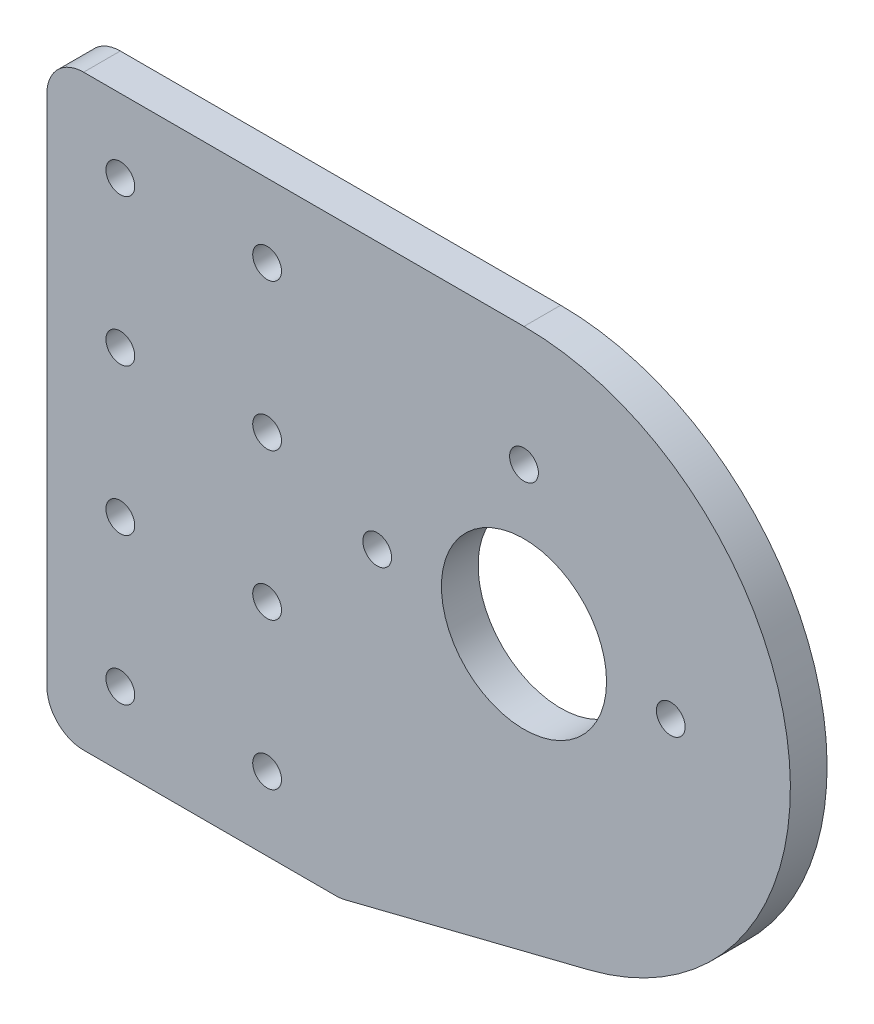
ISO-10303-21;
HEADER;
FILE_DESCRIPTION(('STEP AP214'),'2;1');
FILE_NAME('part.step','',(''),(''),'','','');
FILE_SCHEMA(('AUTOMOTIVE_DESIGN { 1 0 10303 214 1 1 1 1 }'));
ENDSEC;
DATA;
#1=APPLICATION_CONTEXT('core data for automotive mechanical design processes');
#2=APPLICATION_PROTOCOL_DEFINITION('international standard','automotive_design',2000,#1);
#3=PRODUCT_CONTEXT('',#1,'mechanical');
#4=PRODUCT('Part','Part','',(#3));
#5=PRODUCT_RELATED_PRODUCT_CATEGORY('part','',(#4));
#6=PRODUCT_DEFINITION_FORMATION('','',#4);
#7=PRODUCT_DEFINITION_CONTEXT('part definition',#1,'design');
#8=PRODUCT_DEFINITION('design','',#6,#7);
#9=PRODUCT_DEFINITION_SHAPE('','',#8);
#10=(LENGTH_UNIT() NAMED_UNIT(*) SI_UNIT(.MILLI.,.METRE.));
#11=(NAMED_UNIT(*) PLANE_ANGLE_UNIT() SI_UNIT($,.RADIAN.));
#12=(NAMED_UNIT(*) SI_UNIT($,.STERADIAN.) SOLID_ANGLE_UNIT());
#13=UNCERTAINTY_MEASURE_WITH_UNIT(LENGTH_MEASURE(1.E-05),#10,'distance_accuracy_value','');
#14=(GEOMETRIC_REPRESENTATION_CONTEXT(3) GLOBAL_UNCERTAINTY_ASSIGNED_CONTEXT((#13)) GLOBAL_UNIT_ASSIGNED_CONTEXT((#10,
#11,#12)) REPRESENTATION_CONTEXT('',''));
#15=CARTESIAN_POINT('',(0.,0.,0.));
#16=DIRECTION('',(0.,0.,1.));
#17=DIRECTION('',(1.,0.,0.));
#18=AXIS2_PLACEMENT_3D('',#15,#16,#17);
#19=CARTESIAN_POINT('',(482.6,477.901,6.35));
#20=DIRECTION('',(1.,0.,0.));
#21=DIRECTION('',(0.,0.,-1.));
#22=AXIS2_PLACEMENT_3D('',#19,#20,#21);
#23=PLANE('',#22);
#24=DIRECTION('',(0.,-1.,0.));
#25=VECTOR('',#24,1.);
#26=CARTESIAN_POINT('',(482.6,477.901,0.));
#27=LINE('',#26,#25);
#28=CARTESIAN_POINT('',(482.6,471.551,0.));
#29=VERTEX_POINT('',#28);
#30=CARTESIAN_POINT('',(482.6,382.651,0.));
#31=VERTEX_POINT('',#30);
#32=EDGE_CURVE('E138',#29,#31,#27,.T.);
#33=ORIENTED_EDGE('',*,*,#32,.T.);
#34=DIRECTION('',(0.,0.,-1.));
#35=VECTOR('',#34,1.);
#36=CARTESIAN_POINT('',(482.6,382.651,6.35));
#37=LINE('',#36,#35);
#38=CARTESIAN_POINT('',(482.6,382.651,6.35));
#39=VERTEX_POINT('',#38);
#40=EDGE_CURVE('E49',#31,#39,#37,.F.);
#41=ORIENTED_EDGE('',*,*,#40,.T.);
#42=DIRECTION('',(0.,-1.,0.));
#43=VECTOR('',#42,1.);
#44=CARTESIAN_POINT('',(482.6,477.901,6.35));
#45=LINE('',#44,#43);
#46=CARTESIAN_POINT('',(482.6,471.551,6.35));
#47=VERTEX_POINT('',#46);
#48=EDGE_CURVE('E149',#47,#39,#45,.T.);
#49=ORIENTED_EDGE('',*,*,#48,.F.);
#50=DIRECTION('',(0.,0.,-1.));
#51=VECTOR('',#50,1.);
#52=CARTESIAN_POINT('',(482.6,471.551,0.));
#53=LINE('',#52,#51);
#54=EDGE_CURVE('E168',#47,#29,#53,.T.);
#55=ORIENTED_EDGE('',*,*,#54,.T.);
#56=EDGE_LOOP('',(#33,#41,#49,#55));
#57=FACE_BOUND('',#56,.T.);
#58=ADVANCED_FACE('F41',(#57),#23,.F.);
#59=CARTESIAN_POINT('',(482.6,376.301,6.35));
#60=DIRECTION('',(0.,1.,0.));
#61=DIRECTION('',(0.,0.,1.));
#62=AXIS2_PLACEMENT_3D('',#59,#60,#61);
#63=PLANE('',#62);
#64=DIRECTION('',(1.,0.,0.));
#65=VECTOR('',#64,1.);
#66=CARTESIAN_POINT('',(482.6,376.301,0.));
#67=LINE('',#66,#65);
#68=CARTESIAN_POINT('',(488.95,376.301,0.));
#69=VERTEX_POINT('',#68);
#70=CARTESIAN_POINT('',(532.615336287617,376.301,0.));
#71=VERTEX_POINT('',#70);
#72=EDGE_CURVE('E140',#69,#71,#67,.T.);
#73=ORIENTED_EDGE('',*,*,#72,.T.);
#74=DIRECTION('',(0.,0.,-1.));
#75=VECTOR('',#74,1.);
#76=CARTESIAN_POINT('',(532.615336287617,376.301,6.35));
#77=LINE('',#76,#75);
#78=CARTESIAN_POINT('',(532.615336287617,376.301,6.35));
#79=VERTEX_POINT('',#78);
#80=EDGE_CURVE('E161',#71,#79,#77,.F.);
#81=ORIENTED_EDGE('',*,*,#80,.T.);
#82=DIRECTION('',(1.,0.,0.));
#83=VECTOR('',#82,1.);
#84=CARTESIAN_POINT('',(482.6,376.301,6.35));
#85=LINE('',#84,#83);
#86=CARTESIAN_POINT('',(488.95,376.301,6.35));
#87=VERTEX_POINT('',#86);
#88=EDGE_CURVE('E117',#87,#79,#85,.T.);
#89=ORIENTED_EDGE('',*,*,#88,.F.);
#90=DIRECTION('',(0.,0.,-1.));
#91=VECTOR('',#90,1.);
#92=CARTESIAN_POINT('',(488.95,376.301,6.35));
#93=LINE('',#92,#91);
#94=EDGE_CURVE('E158',#87,#69,#93,.T.);
#95=ORIENTED_EDGE('',*,*,#94,.T.);
#96=EDGE_LOOP('',(#73,#81,#89,#95));
#97=FACE_BOUND('',#96,.T.);
#98=ADVANCED_FACE('F183',(#97),#63,.F.);
#99=CARTESIAN_POINT('',(533.4,376.301,6.35));
#100=DIRECTION('',(-0.243421299497325,0.969920651883974,0.));
#101=DIRECTION('',(-0.969920651883974,-0.243421299497325,0.));
#102=AXIS2_PLACEMENT_3D('',#99,#100,#101);
#103=PLANE('',#102);
#104=DIRECTION('',(0.969920651883974,0.243421299497325,0.));
#105=VECTOR('',#104,1.);
#106=CARTESIAN_POINT('',(533.4,376.301,6.35));
#107=LINE('',#106,#105);
#108=CARTESIAN_POINT('',(534.161061539425,376.492003860537,6.35));
#109=VERTEX_POINT('',#108);
#110=CARTESIAN_POINT('',(576.37196532811,387.085688027628,6.35));
#111=VERTEX_POINT('',#110);
#112=EDGE_CURVE('E106',#109,#111,#107,.T.);
#113=ORIENTED_EDGE('',*,*,#112,.F.);
#114=DIRECTION('',(0.,0.,-1.));
#115=VECTOR('',#114,1.);
#116=CARTESIAN_POINT('',(534.161061539425,376.492003860537,6.35));
#117=LINE('',#116,#115);
#118=CARTESIAN_POINT('',(534.161061539425,376.492003860537,0.));
#119=VERTEX_POINT('',#118);
#120=EDGE_CURVE('E127',#109,#119,#117,.T.);
#121=ORIENTED_EDGE('',*,*,#120,.T.);
#122=DIRECTION('',(0.969920651883974,0.243421299497325,0.));
#123=VECTOR('',#122,1.);
#124=CARTESIAN_POINT('',(533.4,376.301,0.));
#125=LINE('',#124,#123);
#126=CARTESIAN_POINT('',(576.37196532811,387.085688027628,0.));
#127=VERTEX_POINT('',#126);
#128=EDGE_CURVE('E123',#119,#127,#125,.T.);
#129=ORIENTED_EDGE('',*,*,#128,.T.);
#130=DIRECTION('',(0.,0.,-1.));
#131=VECTOR('',#130,1.);
#132=CARTESIAN_POINT('',(576.37196532811,387.085688027628,6.35));
#133=LINE('',#132,#131);
#134=EDGE_CURVE('E120',#111,#127,#133,.T.);
#135=ORIENTED_EDGE('',*,*,#134,.F.);
#136=EDGE_LOOP('',(#113,#121,#129,#135));
#137=FACE_BOUND('',#136,.T.);
#138=ADVANCED_FACE('F121',(#137),#103,.F.);
#139=CARTESIAN_POINT('',(565.15,431.800000000067,6.35));
#140=DIRECTION('',(0.,0.,-1.));
#141=DIRECTION('',(-1.,0.,0.));
#142=AXIS2_PLACEMENT_3D('',#139,#140,#141);
#143=CYLINDRICAL_SURFACE('',#142,46.1009999999333);
#144=CARTESIAN_POINT('',(565.15,431.800000000067,0.));
#145=DIRECTION('',(0.,0.,-1.));
#146=DIRECTION('',(-1.,0.,0.));
#147=AXIS2_PLACEMENT_3D('',#144,#145,#146);
#148=CIRCLE('',#147,46.1009999999333);
#149=CARTESIAN_POINT('',(565.15,477.901,0.));
#150=VERTEX_POINT('',#149);
#151=EDGE_CURVE('E145',#150,#127,#148,.T.);
#152=ORIENTED_EDGE('',*,*,#151,.F.);
#153=DIRECTION('',(0.,0.,-1.));
#154=VECTOR('',#153,1.);
#155=CARTESIAN_POINT('',(565.15,477.901,6.35));
#156=LINE('',#155,#154);
#157=CARTESIAN_POINT('',(565.15,477.901,6.35));
#158=VERTEX_POINT('',#157);
#159=EDGE_CURVE('E128',#158,#150,#156,.T.);
#160=ORIENTED_EDGE('',*,*,#159,.F.);
#161=CARTESIAN_POINT('',(565.15,431.800000000067,6.35));
#162=DIRECTION('',(0.,0.,-1.));
#163=DIRECTION('',(-1.,0.,0.));
#164=AXIS2_PLACEMENT_3D('',#161,#162,#163);
#165=CIRCLE('',#164,46.1009999999333);
#166=EDGE_CURVE('E111',#158,#111,#165,.T.);
#167=ORIENTED_EDGE('',*,*,#166,.T.);
#168=ORIENTED_EDGE('',*,*,#134,.T.);
#169=EDGE_LOOP('',(#152,#160,#167,#168));
#170=FACE_BOUND('',#169,.T.);
#171=ADVANCED_FACE('F131',(#170),#143,.T.);
#172=CARTESIAN_POINT('',(482.6,477.901,6.35));
#173=DIRECTION('',(0.,1.,0.));
#174=DIRECTION('',(0.,0.,1.));
#175=AXIS2_PLACEMENT_3D('',#172,#173,#174);
#176=PLANE('',#175);
#177=DIRECTION('',(1.,0.,0.));
#178=VECTOR('',#177,1.);
#179=CARTESIAN_POINT('',(482.6,477.901,0.));
#180=LINE('',#179,#178);
#181=CARTESIAN_POINT('',(488.95,477.901,0.));
#182=VERTEX_POINT('',#181);
#183=EDGE_CURVE('E147',#182,#150,#180,.T.);
#184=ORIENTED_EDGE('',*,*,#183,.F.);
#185=DIRECTION('',(0.,0.,-1.));
#186=VECTOR('',#185,1.);
#187=CARTESIAN_POINT('',(488.95,477.901,6.35));
#188=LINE('',#187,#186);
#189=CARTESIAN_POINT('',(488.95,477.901,6.35));
#190=VERTEX_POINT('',#189);
#191=EDGE_CURVE('E11',#182,#190,#188,.F.);
#192=ORIENTED_EDGE('',*,*,#191,.T.);
#193=DIRECTION('',(1.,0.,0.));
#194=VECTOR('',#193,1.);
#195=CARTESIAN_POINT('',(482.6,477.901,6.35));
#196=LINE('',#195,#194);
#197=EDGE_CURVE('E133',#190,#158,#196,.T.);
#198=ORIENTED_EDGE('',*,*,#197,.T.);
#199=ORIENTED_EDGE('',*,*,#159,.T.);
#200=EDGE_LOOP('',(#184,#192,#198,#199));
#201=FACE_BOUND('',#200,.T.);
#202=ADVANCED_FACE('F296',(#201),#176,.T.);
#203=CARTESIAN_POINT('',(565.15,431.800000000067,6.35));
#204=DIRECTION('',(0.,0.,-1.));
#205=DIRECTION('',(-1.,0.,0.));
#206=AXIS2_PLACEMENT_3D('',#203,#204,#205);
#207=PLANE('',#206);
#208=CARTESIAN_POINT('',(520.7,414.401,6.35));
#209=DIRECTION('',(0.,0.,1.));
#210=DIRECTION('',(1.,0.,0.));
#211=AXIS2_PLACEMENT_3D('',#208,#209,#210);
#212=CIRCLE('',#211,2.48919999999983);
#213=CARTESIAN_POINT('',(523.1892,414.401,6.35));
#214=VERTEX_POINT('',#213);
#215=EDGE_CURVE('E224',#214,#214,#212,.T.);
#216=ORIENTED_EDGE('',*,*,#215,.F.);
#217=EDGE_LOOP('',(#216));
#218=FACE_BOUND('',#217,.T.);
#219=CARTESIAN_POINT('',(495.3,389.001,6.35));
#220=DIRECTION('',(0.,0.,1.));
#221=DIRECTION('',(1.,0.,0.));
#222=AXIS2_PLACEMENT_3D('',#219,#220,#221);
#223=CIRCLE('',#222,2.48919999999983);
#224=CARTESIAN_POINT('',(497.7892,389.001,6.35));
#225=VERTEX_POINT('',#224);
#226=EDGE_CURVE('E217',#225,#225,#223,.T.);
#227=ORIENTED_EDGE('',*,*,#226,.F.);
#228=EDGE_LOOP('',(#227));
#229=FACE_BOUND('',#228,.T.);
#230=CARTESIAN_POINT('',(520.7,389.001,6.35));
#231=DIRECTION('',(0.,0.,1.));
#232=DIRECTION('',(1.,0.,0.));
#233=AXIS2_PLACEMENT_3D('',#230,#231,#232);
#234=CIRCLE('',#233,2.48919999999983);
#235=CARTESIAN_POINT('',(523.1892,389.001,6.35));
#236=VERTEX_POINT('',#235);
#237=EDGE_CURVE('E236',#236,#236,#234,.T.);
#238=ORIENTED_EDGE('',*,*,#237,.F.);
#239=EDGE_LOOP('',(#238));
#240=FACE_BOUND('',#239,.T.);
#241=CARTESIAN_POINT('',(565.15,431.800000000067,6.35));
#242=DIRECTION('',(0.,0.,1.));
#243=DIRECTION('',(1.,0.,0.));
#244=AXIS2_PLACEMENT_3D('',#241,#242,#243);
#245=CIRCLE('',#244,14.2875);
#246=CARTESIAN_POINT('',(579.4375,431.800000000067,6.35));
#247=VERTEX_POINT('',#246);
#248=EDGE_CURVE('E229',#247,#247,#245,.T.);
#249=ORIENTED_EDGE('',*,*,#248,.F.);
#250=EDGE_LOOP('',(#249));
#251=FACE_BOUND('',#250,.T.);
#252=CARTESIAN_POINT('',(495.3,414.401,6.35));
#253=DIRECTION('',(0.,0.,1.));
#254=DIRECTION('',(1.,0.,0.));
#255=AXIS2_PLACEMENT_3D('',#252,#253,#254);
#256=CIRCLE('',#255,2.48919999999995);
#257=CARTESIAN_POINT('',(497.7892,414.401,6.35));
#258=VERTEX_POINT('',#257);
#259=EDGE_CURVE('E193',#258,#258,#256,.T.);
#260=ORIENTED_EDGE('',*,*,#259,.F.);
#261=EDGE_LOOP('',(#260));
#262=FACE_BOUND('',#261,.T.);
#263=CARTESIAN_POINT('',(495.3,439.801,6.35));
#264=DIRECTION('',(0.,0.,1.));
#265=DIRECTION('',(1.,0.,0.));
#266=AXIS2_PLACEMENT_3D('',#263,#264,#265);
#267=CIRCLE('',#266,2.48919999999995);
#268=CARTESIAN_POINT('',(497.7892,439.801,6.35));
#269=VERTEX_POINT('',#268);
#270=EDGE_CURVE('E200',#269,#269,#267,.T.);
#271=ORIENTED_EDGE('',*,*,#270,.F.);
#272=EDGE_LOOP('',(#271));
#273=FACE_BOUND('',#272,.T.);
#274=CARTESIAN_POINT('',(520.7,439.801,6.35));
#275=DIRECTION('',(0.,0.,1.));
#276=DIRECTION('',(1.,0.,0.));
#277=AXIS2_PLACEMENT_3D('',#274,#275,#276);
#278=CIRCLE('',#277,2.48919999999995);
#279=CARTESIAN_POINT('',(523.1892,439.801,6.35));
#280=VERTEX_POINT('',#279);
#281=EDGE_CURVE('E206',#280,#280,#278,.T.);
#282=ORIENTED_EDGE('',*,*,#281,.F.);
#283=EDGE_LOOP('',(#282));
#284=FACE_BOUND('',#283,.T.);
#285=CARTESIAN_POINT('',(520.7,465.201,6.35));
#286=DIRECTION('',(0.,0.,1.));
#287=DIRECTION('',(1.,0.,0.));
#288=AXIS2_PLACEMENT_3D('',#285,#286,#287);
#289=CIRCLE('',#288,2.48919999999995);
#290=CARTESIAN_POINT('',(523.1892,465.201,6.35));
#291=VERTEX_POINT('',#290);
#292=EDGE_CURVE('E212',#291,#291,#289,.T.);
#293=ORIENTED_EDGE('',*,*,#292,.F.);
#294=EDGE_LOOP('',(#293));
#295=FACE_BOUND('',#294,.T.);
#296=CARTESIAN_POINT('',(565.15,457.200000000067,6.35));
#297=DIRECTION('',(0.,0.,1.));
#298=DIRECTION('',(1.,0.,0.));
#299=AXIS2_PLACEMENT_3D('',#296,#297,#298);
#300=CIRCLE('',#299,2.48919999999995);
#301=CARTESIAN_POINT('',(567.6392,457.200000000067,6.35));
#302=VERTEX_POINT('',#301);
#303=EDGE_CURVE('E253',#302,#302,#300,.T.);
#304=ORIENTED_EDGE('',*,*,#303,.F.);
#305=EDGE_LOOP('',(#304));
#306=FACE_BOUND('',#305,.T.);
#307=CARTESIAN_POINT('',(590.55,431.800000000067,6.35));
#308=DIRECTION('',(0.,0.,1.));
#309=DIRECTION('',(1.,0.,0.));
#310=AXIS2_PLACEMENT_3D('',#307,#308,#309);
#311=CIRCLE('',#310,2.48919999999995);
#312=CARTESIAN_POINT('',(593.0392,431.800000000067,6.35));
#313=VERTEX_POINT('',#312);
#314=EDGE_CURVE('E247',#313,#313,#311,.T.);
#315=ORIENTED_EDGE('',*,*,#314,.F.);
#316=EDGE_LOOP('',(#315));
#317=FACE_BOUND('',#316,.T.);
#318=CARTESIAN_POINT('',(539.75,431.800000000067,6.35));
#319=DIRECTION('',(0.,0.,1.));
#320=DIRECTION('',(1.,0.,0.));
#321=AXIS2_PLACEMENT_3D('',#318,#319,#320);
#322=CIRCLE('',#321,2.48919999999995);
#323=CARTESIAN_POINT('',(542.2392,431.800000000067,6.35));
#324=VERTEX_POINT('',#323);
#325=EDGE_CURVE('E241',#324,#324,#322,.T.);
#326=ORIENTED_EDGE('',*,*,#325,.F.);
#327=EDGE_LOOP('',(#326));
#328=FACE_BOUND('',#327,.T.);
#329=CARTESIAN_POINT('',(495.3,465.201,6.35));
#330=DIRECTION('',(0.,0.,1.));
#331=DIRECTION('',(1.,0.,0.));
#332=AXIS2_PLACEMENT_3D('',#329,#330,#331);
#333=CIRCLE('',#332,2.48920000000001);
#334=CARTESIAN_POINT('',(497.7892,465.201,6.35));
#335=VERTEX_POINT('',#334);
#336=EDGE_CURVE('E141',#335,#335,#333,.T.);
#337=ORIENTED_EDGE('',*,*,#336,.F.);
#338=EDGE_LOOP('',(#337));
#339=FACE_BOUND('',#338,.T.);
#340=ORIENTED_EDGE('',*,*,#88,.T.);
#341=CARTESIAN_POINT('',(532.615336287617,382.651,6.35));
#342=DIRECTION('',(0.,0.,-1.));
#343=DIRECTION('',(-1.,0.,0.));
#344=AXIS2_PLACEMENT_3D('',#341,#342,#343);
#345=CIRCLE('',#344,6.35);
#346=EDGE_CURVE('E113',#79,#109,#345,.F.);
#347=ORIENTED_EDGE('',*,*,#346,.T.);
#348=ORIENTED_EDGE('',*,*,#112,.T.);
#349=ORIENTED_EDGE('',*,*,#166,.F.);
#350=ORIENTED_EDGE('',*,*,#197,.F.);
#351=CARTESIAN_POINT('',(488.95,471.551,6.35));
#352=DIRECTION('',(0.,0.,-1.));
#353=DIRECTION('',(-1.,0.,0.));
#354=AXIS2_PLACEMENT_3D('',#351,#352,#353);
#355=CIRCLE('',#354,6.35);
#356=EDGE_CURVE('E163',#190,#47,#355,.F.);
#357=ORIENTED_EDGE('',*,*,#356,.T.);
#358=ORIENTED_EDGE('',*,*,#48,.T.);
#359=CARTESIAN_POINT('',(488.95,382.651,6.35));
#360=DIRECTION('',(0.,0.,-1.));
#361=DIRECTION('',(-1.,0.,0.));
#362=AXIS2_PLACEMENT_3D('',#359,#360,#361);
#363=CIRCLE('',#362,6.35);
#364=EDGE_CURVE('E165',#39,#87,#363,.F.);
#365=ORIENTED_EDGE('',*,*,#364,.T.);
#366=EDGE_LOOP('',(#340,#347,#348,#349,#350,#357,#358,#365));
#367=FACE_BOUND('',#366,.T.);
#368=ADVANCED_FACE('F109',(#218,#229,#240,#251,#262,#273,#284,#295,#306,#317,#328,#339,#367),
#207,.F.);
#369=CARTESIAN_POINT('',(565.15,431.800000000067,0.));
#370=DIRECTION('',(0.,0.,-1.));
#371=DIRECTION('',(-1.,0.,0.));
#372=AXIS2_PLACEMENT_3D('',#369,#370,#371);
#373=PLANE('',#372);
#374=CARTESIAN_POINT('',(520.7,414.401,0.));
#375=DIRECTION('',(0.,0.,1.));
#376=DIRECTION('',(1.,0.,0.));
#377=AXIS2_PLACEMENT_3D('',#374,#375,#376);
#378=CIRCLE('',#377,2.48919999999983);
#379=CARTESIAN_POINT('',(523.1892,414.401,0.));
#380=VERTEX_POINT('',#379);
#381=EDGE_CURVE('E197',#380,#380,#378,.T.);
#382=ORIENTED_EDGE('',*,*,#381,.T.);
#383=EDGE_LOOP('',(#382));
#384=FACE_BOUND('',#383,.T.);
#385=CARTESIAN_POINT('',(495.3,389.001,0.));
#386=DIRECTION('',(0.,0.,1.));
#387=DIRECTION('',(1.,0.,0.));
#388=AXIS2_PLACEMENT_3D('',#385,#386,#387);
#389=CIRCLE('',#388,2.48919999999983);
#390=CARTESIAN_POINT('',(497.7892,389.001,0.));
#391=VERTEX_POINT('',#390);
#392=EDGE_CURVE('E220',#391,#391,#389,.T.);
#393=ORIENTED_EDGE('',*,*,#392,.T.);
#394=EDGE_LOOP('',(#393));
#395=FACE_BOUND('',#394,.T.);
#396=CARTESIAN_POINT('',(520.7,389.001,0.));
#397=DIRECTION('',(0.,0.,1.));
#398=DIRECTION('',(1.,0.,0.));
#399=AXIS2_PLACEMENT_3D('',#396,#397,#398);
#400=CIRCLE('',#399,2.48919999999983);
#401=CARTESIAN_POINT('',(523.1892,389.001,0.));
#402=VERTEX_POINT('',#401);
#403=EDGE_CURVE('E221',#402,#402,#400,.T.);
#404=ORIENTED_EDGE('',*,*,#403,.T.);
#405=EDGE_LOOP('',(#404));
#406=FACE_BOUND('',#405,.T.);
#407=CARTESIAN_POINT('',(565.15,431.800000000067,0.));
#408=DIRECTION('',(0.,0.,1.));
#409=DIRECTION('',(1.,0.,0.));
#410=AXIS2_PLACEMENT_3D('',#407,#408,#409);
#411=CIRCLE('',#410,14.2875);
#412=CARTESIAN_POINT('',(579.4375,431.800000000067,0.));
#413=VERTEX_POINT('',#412);
#414=EDGE_CURVE('E232',#413,#413,#411,.T.);
#415=ORIENTED_EDGE('',*,*,#414,.T.);
#416=EDGE_LOOP('',(#415));
#417=FACE_BOUND('',#416,.T.);
#418=CARTESIAN_POINT('',(495.3,414.401,0.));
#419=DIRECTION('',(0.,0.,1.));
#420=DIRECTION('',(1.,0.,0.));
#421=AXIS2_PLACEMENT_3D('',#418,#419,#420);
#422=CIRCLE('',#421,2.48919999999995);
#423=CARTESIAN_POINT('',(497.7892,414.401,0.));
#424=VERTEX_POINT('',#423);
#425=EDGE_CURVE('E196',#424,#424,#422,.T.);
#426=ORIENTED_EDGE('',*,*,#425,.T.);
#427=EDGE_LOOP('',(#426));
#428=FACE_BOUND('',#427,.T.);
#429=CARTESIAN_POINT('',(495.3,439.801,0.));
#430=DIRECTION('',(0.,0.,1.));
#431=DIRECTION('',(1.,0.,0.));
#432=AXIS2_PLACEMENT_3D('',#429,#430,#431);
#433=CIRCLE('',#432,2.48919999999995);
#434=CARTESIAN_POINT('',(497.7892,439.801,0.));
#435=VERTEX_POINT('',#434);
#436=EDGE_CURVE('E203',#435,#435,#433,.T.);
#437=ORIENTED_EDGE('',*,*,#436,.T.);
#438=EDGE_LOOP('',(#437));
#439=FACE_BOUND('',#438,.T.);
#440=CARTESIAN_POINT('',(520.7,439.801,0.));
#441=DIRECTION('',(0.,0.,1.));
#442=DIRECTION('',(1.,0.,0.));
#443=AXIS2_PLACEMENT_3D('',#440,#441,#442);
#444=CIRCLE('',#443,2.48919999999995);
#445=CARTESIAN_POINT('',(523.1892,439.801,0.));
#446=VERTEX_POINT('',#445);
#447=EDGE_CURVE('E209',#446,#446,#444,.T.);
#448=ORIENTED_EDGE('',*,*,#447,.T.);
#449=EDGE_LOOP('',(#448));
#450=FACE_BOUND('',#449,.T.);
#451=CARTESIAN_POINT('',(520.7,465.201,0.));
#452=DIRECTION('',(0.,0.,1.));
#453=DIRECTION('',(1.,0.,0.));
#454=AXIS2_PLACEMENT_3D('',#451,#452,#453);
#455=CIRCLE('',#454,2.48919999999995);
#456=CARTESIAN_POINT('',(523.1892,465.201,0.));
#457=VERTEX_POINT('',#456);
#458=EDGE_CURVE('E190',#457,#457,#455,.T.);
#459=ORIENTED_EDGE('',*,*,#458,.T.);
#460=EDGE_LOOP('',(#459));
#461=FACE_BOUND('',#460,.T.);
#462=CARTESIAN_POINT('',(565.15,457.200000000067,0.));
#463=DIRECTION('',(0.,0.,1.));
#464=DIRECTION('',(1.,0.,0.));
#465=AXIS2_PLACEMENT_3D('',#462,#463,#464);
#466=CIRCLE('',#465,2.48919999999995);
#467=CARTESIAN_POINT('',(567.6392,457.200000000067,0.));
#468=VERTEX_POINT('',#467);
#469=EDGE_CURVE('E233',#468,#468,#466,.T.);
#470=ORIENTED_EDGE('',*,*,#469,.T.);
#471=EDGE_LOOP('',(#470));
#472=FACE_BOUND('',#471,.T.);
#473=CARTESIAN_POINT('',(590.55,431.800000000067,0.));
#474=DIRECTION('',(0.,0.,1.));
#475=DIRECTION('',(1.,0.,0.));
#476=AXIS2_PLACEMENT_3D('',#473,#474,#475);
#477=CIRCLE('',#476,2.48919999999995);
#478=CARTESIAN_POINT('',(593.0392,431.800000000067,0.));
#479=VERTEX_POINT('',#478);
#480=EDGE_CURVE('E250',#479,#479,#477,.T.);
#481=ORIENTED_EDGE('',*,*,#480,.T.);
#482=EDGE_LOOP('',(#481));
#483=FACE_BOUND('',#482,.T.);
#484=CARTESIAN_POINT('',(539.75,431.800000000067,0.));
#485=DIRECTION('',(0.,0.,1.));
#486=DIRECTION('',(1.,0.,0.));
#487=AXIS2_PLACEMENT_3D('',#484,#485,#486);
#488=CIRCLE('',#487,2.48919999999995);
#489=CARTESIAN_POINT('',(542.2392,431.800000000067,0.));
#490=VERTEX_POINT('',#489);
#491=EDGE_CURVE('E244',#490,#490,#488,.T.);
#492=ORIENTED_EDGE('',*,*,#491,.T.);
#493=EDGE_LOOP('',(#492));
#494=FACE_BOUND('',#493,.T.);
#495=CARTESIAN_POINT('',(495.3,465.201,0.));
#496=DIRECTION('',(0.,0.,1.));
#497=DIRECTION('',(1.,0.,0.));
#498=AXIS2_PLACEMENT_3D('',#495,#496,#497);
#499=CIRCLE('',#498,2.48920000000001);
#500=CARTESIAN_POINT('',(497.7892,465.201,0.));
#501=VERTEX_POINT('',#500);
#502=EDGE_CURVE('E187',#501,#501,#499,.T.);
#503=ORIENTED_EDGE('',*,*,#502,.T.);
#504=EDGE_LOOP('',(#503));
#505=FACE_BOUND('',#504,.T.);
#506=ORIENTED_EDGE('',*,*,#128,.F.);
#507=CARTESIAN_POINT('',(532.615336287617,382.651,0.));
#508=DIRECTION('',(0.,0.,-1.));
#509=DIRECTION('',(-1.,0.,0.));
#510=AXIS2_PLACEMENT_3D('',#507,#508,#509);
#511=CIRCLE('',#510,6.35);
#512=EDGE_CURVE('E156',#119,#71,#511,.T.);
#513=ORIENTED_EDGE('',*,*,#512,.T.);
#514=ORIENTED_EDGE('',*,*,#72,.F.);
#515=CARTESIAN_POINT('',(488.95,382.651,0.));
#516=DIRECTION('',(0.,0.,-1.));
#517=DIRECTION('',(-1.,0.,0.));
#518=AXIS2_PLACEMENT_3D('',#515,#516,#517);
#519=CIRCLE('',#518,6.35);
#520=EDGE_CURVE('E154',#69,#31,#519,.T.);
#521=ORIENTED_EDGE('',*,*,#520,.T.);
#522=ORIENTED_EDGE('',*,*,#32,.F.);
#523=CARTESIAN_POINT('',(488.95,471.551,0.));
#524=DIRECTION('',(0.,0.,-1.));
#525=DIRECTION('',(-1.,0.,0.));
#526=AXIS2_PLACEMENT_3D('',#523,#524,#525);
#527=CIRCLE('',#526,6.35);
#528=EDGE_CURVE('E152',#29,#182,#527,.T.);
#529=ORIENTED_EDGE('',*,*,#528,.T.);
#530=ORIENTED_EDGE('',*,*,#183,.T.);
#531=ORIENTED_EDGE('',*,*,#151,.T.);
#532=EDGE_LOOP('',(#506,#513,#514,#521,#522,#529,#530,#531));
#533=FACE_BOUND('',#532,.T.);
#534=ADVANCED_FACE('F175',(#384,#395,#406,#417,#428,#439,#450,#461,#472,#483,#494,#505,#533),
#373,.T.);
#535=CARTESIAN_POINT('',(495.3,465.201,6.35));
#536=DIRECTION('',(0.,0.,-1.));
#537=DIRECTION('',(-1.,0.,0.));
#538=AXIS2_PLACEMENT_3D('',#535,#536,#537);
#539=CYLINDRICAL_SURFACE('',#538,2.48920000000001);
#540=ORIENTED_EDGE('',*,*,#336,.T.);
#541=EDGE_LOOP('',(#540));
#542=FACE_BOUND('',#541,.T.);
#543=ORIENTED_EDGE('',*,*,#502,.F.);
#544=EDGE_LOOP('',(#543));
#545=FACE_BOUND('',#544,.T.);
#546=ADVANCED_FACE('F343',(#542,#545),#539,.F.);
#547=CARTESIAN_POINT('',(539.75,431.800000000067,6.35));
#548=DIRECTION('',(0.,0.,-1.));
#549=DIRECTION('',(-1.,0.,0.));
#550=AXIS2_PLACEMENT_3D('',#547,#548,#549);
#551=CYLINDRICAL_SURFACE('',#550,2.48919999999995);
#552=ORIENTED_EDGE('',*,*,#325,.T.);
#553=EDGE_LOOP('',(#552));
#554=FACE_BOUND('',#553,.T.);
#555=ORIENTED_EDGE('',*,*,#491,.F.);
#556=EDGE_LOOP('',(#555));
#557=FACE_BOUND('',#556,.T.);
#558=ADVANCED_FACE('F274',(#554,#557),#551,.F.);
#559=CARTESIAN_POINT('',(590.55,431.800000000067,6.35));
#560=DIRECTION('',(0.,0.,-1.));
#561=DIRECTION('',(-1.,0.,0.));
#562=AXIS2_PLACEMENT_3D('',#559,#560,#561);
#563=CYLINDRICAL_SURFACE('',#562,2.48919999999995);
#564=ORIENTED_EDGE('',*,*,#314,.T.);
#565=EDGE_LOOP('',(#564));
#566=FACE_BOUND('',#565,.T.);
#567=ORIENTED_EDGE('',*,*,#480,.F.);
#568=EDGE_LOOP('',(#567));
#569=FACE_BOUND('',#568,.T.);
#570=ADVANCED_FACE('F264',(#566,#569),#563,.F.);
#571=CARTESIAN_POINT('',(565.15,457.200000000067,6.35));
#572=DIRECTION('',(0.,0.,-1.));
#573=DIRECTION('',(-1.,0.,0.));
#574=AXIS2_PLACEMENT_3D('',#571,#572,#573);
#575=CYLINDRICAL_SURFACE('',#574,2.48919999999995);
#576=ORIENTED_EDGE('',*,*,#303,.T.);
#577=EDGE_LOOP('',(#576));
#578=FACE_BOUND('',#577,.T.);
#579=ORIENTED_EDGE('',*,*,#469,.F.);
#580=EDGE_LOOP('',(#579));
#581=FACE_BOUND('',#580,.T.);
#582=ADVANCED_FACE('F261',(#578,#581),#575,.F.);
#583=CARTESIAN_POINT('',(520.7,465.201,6.35));
#584=DIRECTION('',(0.,0.,-1.));
#585=DIRECTION('',(-1.,0.,0.));
#586=AXIS2_PLACEMENT_3D('',#583,#584,#585);
#587=CYLINDRICAL_SURFACE('',#586,2.48919999999995);
#588=ORIENTED_EDGE('',*,*,#292,.T.);
#589=EDGE_LOOP('',(#588));
#590=FACE_BOUND('',#589,.T.);
#591=ORIENTED_EDGE('',*,*,#458,.F.);
#592=EDGE_LOOP('',(#591));
#593=FACE_BOUND('',#592,.T.);
#594=ADVANCED_FACE('F263',(#590,#593),#587,.F.);
#595=CARTESIAN_POINT('',(520.7,439.801,6.35));
#596=DIRECTION('',(0.,0.,-1.));
#597=DIRECTION('',(-1.,0.,0.));
#598=AXIS2_PLACEMENT_3D('',#595,#596,#597);
#599=CYLINDRICAL_SURFACE('',#598,2.48919999999995);
#600=ORIENTED_EDGE('',*,*,#281,.T.);
#601=EDGE_LOOP('',(#600));
#602=FACE_BOUND('',#601,.T.);
#603=ORIENTED_EDGE('',*,*,#447,.F.);
#604=EDGE_LOOP('',(#603));
#605=FACE_BOUND('',#604,.T.);
#606=ADVANCED_FACE('F271',(#602,#605),#599,.F.);
#607=CARTESIAN_POINT('',(495.3,439.801,6.35));
#608=DIRECTION('',(0.,0.,-1.));
#609=DIRECTION('',(-1.,0.,0.));
#610=AXIS2_PLACEMENT_3D('',#607,#608,#609);
#611=CYLINDRICAL_SURFACE('',#610,2.48919999999995);
#612=ORIENTED_EDGE('',*,*,#270,.T.);
#613=EDGE_LOOP('',(#612));
#614=FACE_BOUND('',#613,.T.);
#615=ORIENTED_EDGE('',*,*,#436,.F.);
#616=EDGE_LOOP('',(#615));
#617=FACE_BOUND('',#616,.T.);
#618=ADVANCED_FACE('F381',(#614,#617),#611,.F.);
#619=CARTESIAN_POINT('',(495.3,414.401,6.35));
#620=DIRECTION('',(0.,0.,-1.));
#621=DIRECTION('',(-1.,0.,0.));
#622=AXIS2_PLACEMENT_3D('',#619,#620,#621);
#623=CYLINDRICAL_SURFACE('',#622,2.48919999999995);
#624=ORIENTED_EDGE('',*,*,#259,.T.);
#625=EDGE_LOOP('',(#624));
#626=FACE_BOUND('',#625,.T.);
#627=ORIENTED_EDGE('',*,*,#425,.F.);
#628=EDGE_LOOP('',(#627));
#629=FACE_BOUND('',#628,.T.);
#630=ADVANCED_FACE('F390',(#626,#629),#623,.F.);
#631=CARTESIAN_POINT('',(565.15,431.800000000067,6.35));
#632=DIRECTION('',(0.,0.,-1.));
#633=DIRECTION('',(-1.,0.,0.));
#634=AXIS2_PLACEMENT_3D('',#631,#632,#633);
#635=CYLINDRICAL_SURFACE('',#634,14.2875);
#636=ORIENTED_EDGE('',*,*,#248,.T.);
#637=EDGE_LOOP('',(#636));
#638=FACE_BOUND('',#637,.T.);
#639=ORIENTED_EDGE('',*,*,#414,.F.);
#640=EDGE_LOOP('',(#639));
#641=FACE_BOUND('',#640,.T.);
#642=ADVANCED_FACE('F399',(#638,#641),#635,.F.);
#643=CARTESIAN_POINT('',(520.7,389.001,6.35));
#644=DIRECTION('',(0.,0.,-1.));
#645=DIRECTION('',(-1.,0.,0.));
#646=AXIS2_PLACEMENT_3D('',#643,#644,#645);
#647=CYLINDRICAL_SURFACE('',#646,2.48919999999983);
#648=ORIENTED_EDGE('',*,*,#237,.T.);
#649=EDGE_LOOP('',(#648));
#650=FACE_BOUND('',#649,.T.);
#651=ORIENTED_EDGE('',*,*,#403,.F.);
#652=EDGE_LOOP('',(#651));
#653=FACE_BOUND('',#652,.T.);
#654=ADVANCED_FACE('F408',(#650,#653),#647,.F.);
#655=CARTESIAN_POINT('',(495.3,389.001,6.35));
#656=DIRECTION('',(0.,0.,-1.));
#657=DIRECTION('',(-1.,0.,0.));
#658=AXIS2_PLACEMENT_3D('',#655,#656,#657);
#659=CYLINDRICAL_SURFACE('',#658,2.48919999999983);
#660=ORIENTED_EDGE('',*,*,#226,.T.);
#661=EDGE_LOOP('',(#660));
#662=FACE_BOUND('',#661,.T.);
#663=ORIENTED_EDGE('',*,*,#392,.F.);
#664=EDGE_LOOP('',(#663));
#665=FACE_BOUND('',#664,.T.);
#666=ADVANCED_FACE('F417',(#662,#665),#659,.F.);
#667=CARTESIAN_POINT('',(520.7,414.401,6.35));
#668=DIRECTION('',(0.,0.,-1.));
#669=DIRECTION('',(-1.,0.,0.));
#670=AXIS2_PLACEMENT_3D('',#667,#668,#669);
#671=CYLINDRICAL_SURFACE('',#670,2.48919999999983);
#672=ORIENTED_EDGE('',*,*,#215,.T.);
#673=EDGE_LOOP('',(#672));
#674=FACE_BOUND('',#673,.T.);
#675=ORIENTED_EDGE('',*,*,#381,.F.);
#676=EDGE_LOOP('',(#675));
#677=FACE_BOUND('',#676,.T.);
#678=ADVANCED_FACE('F288',(#674,#677),#671,.F.);
#679=CARTESIAN_POINT('',(532.615336287617,382.651,6.35));
#680=DIRECTION('',(0.,0.,-1.));
#681=DIRECTION('',(-1.,0.,0.));
#682=AXIS2_PLACEMENT_3D('',#679,#680,#681);
#683=CYLINDRICAL_SURFACE('',#682,6.35);
#684=ORIENTED_EDGE('',*,*,#346,.F.);
#685=ORIENTED_EDGE('',*,*,#80,.F.);
#686=ORIENTED_EDGE('',*,*,#512,.F.);
#687=ORIENTED_EDGE('',*,*,#120,.F.);
#688=EDGE_LOOP('',(#684,#685,#686,#687));
#689=FACE_BOUND('',#688,.T.);
#690=ADVANCED_FACE('F286',(#689),#683,.T.);
#691=CARTESIAN_POINT('',(488.95,382.651,6.35));
#692=DIRECTION('',(0.,0.,-1.));
#693=DIRECTION('',(-1.,0.,0.));
#694=AXIS2_PLACEMENT_3D('',#691,#692,#693);
#695=CYLINDRICAL_SURFACE('',#694,6.35);
#696=ORIENTED_EDGE('',*,*,#364,.F.);
#697=ORIENTED_EDGE('',*,*,#40,.F.);
#698=ORIENTED_EDGE('',*,*,#520,.F.);
#699=ORIENTED_EDGE('',*,*,#94,.F.);
#700=EDGE_LOOP('',(#696,#697,#698,#699));
#701=FACE_BOUND('',#700,.T.);
#702=ADVANCED_FACE('F180',(#701),#695,.T.);
#703=CARTESIAN_POINT('',(488.95,471.551,6.35));
#704=DIRECTION('',(0.,0.,1.));
#705=DIRECTION('',(1.,0.,0.));
#706=AXIS2_PLACEMENT_3D('',#703,#704,#705);
#707=CYLINDRICAL_SURFACE('',#706,6.35);
#708=ORIENTED_EDGE('',*,*,#356,.F.);
#709=ORIENTED_EDGE('',*,*,#191,.F.);
#710=ORIENTED_EDGE('',*,*,#528,.F.);
#711=ORIENTED_EDGE('',*,*,#54,.F.);
#712=EDGE_LOOP('',(#708,#709,#710,#711));
#713=FACE_BOUND('',#712,.T.);
#714=ADVANCED_FACE('F43',(#713),#707,.T.);
#715=CLOSED_SHELL('',(#58,#98,#138,#171,#202,#368,#534,#546,#558,#570,#582,#594,#606,#618,#630,
#642,#654,#666,#678,#690,#702,#714));
#716=MANIFOLD_SOLID_BREP('B2',#715);
#717=ADVANCED_BREP_SHAPE_REPRESENTATION('',(#18,#716),#14);
#718=SHAPE_DEFINITION_REPRESENTATION(#9,#717);
ENDSEC;
END-ISO-10303-21;
